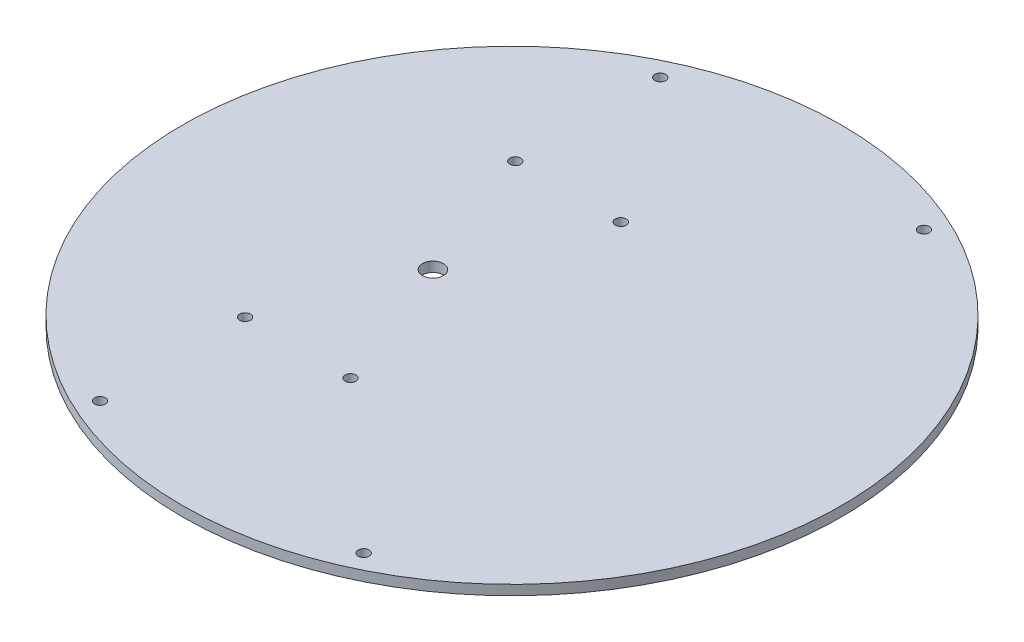
ISO-10303-21;
HEADER;
FILE_DESCRIPTION(('STEP AP214'),'2;1');
FILE_NAME('part.step','',(''),(''),'','','');
FILE_SCHEMA(('AUTOMOTIVE_DESIGN { 1 0 10303 214 1 1 1 1 }'));
ENDSEC;
DATA;
#1=APPLICATION_CONTEXT('core data for automotive mechanical design processes');
#2=APPLICATION_PROTOCOL_DEFINITION('international standard','automotive_design',2000,#1);
#3=PRODUCT_CONTEXT('',#1,'mechanical');
#4=PRODUCT('Part','Part','',(#3));
#5=PRODUCT_RELATED_PRODUCT_CATEGORY('part','',(#4));
#6=PRODUCT_DEFINITION_FORMATION('','',#4);
#7=PRODUCT_DEFINITION_CONTEXT('part definition',#1,'design');
#8=PRODUCT_DEFINITION('design','',#6,#7);
#9=PRODUCT_DEFINITION_SHAPE('','',#8);
#10=(LENGTH_UNIT() NAMED_UNIT(*) SI_UNIT(.MILLI.,.METRE.));
#11=(NAMED_UNIT(*) PLANE_ANGLE_UNIT() SI_UNIT($,.RADIAN.));
#12=(NAMED_UNIT(*) SI_UNIT($,.STERADIAN.) SOLID_ANGLE_UNIT());
#13=UNCERTAINTY_MEASURE_WITH_UNIT(LENGTH_MEASURE(1.E-05),#10,'distance_accuracy_value','');
#14=(GEOMETRIC_REPRESENTATION_CONTEXT(3) GLOBAL_UNCERTAINTY_ASSIGNED_CONTEXT((#13)) GLOBAL_UNIT_ASSIGNED_CONTEXT((#10,
#11,#12)) REPRESENTATION_CONTEXT('',''));
#15=CARTESIAN_POINT('',(0.,0.,0.));
#16=DIRECTION('',(0.,0.,1.));
#17=DIRECTION('',(1.,0.,0.));
#18=AXIS2_PLACEMENT_3D('',#15,#16,#17);
#19=CARTESIAN_POINT('',(0.,3.,0.));
#20=DIRECTION('',(0.,1.,0.));
#21=DIRECTION('',(0.,0.,1.));
#22=AXIS2_PLACEMENT_3D('',#19,#20,#21);
#23=PLANE('',#22);
#24=CARTESIAN_POINT('',(-40.,3.,85.));
#25=DIRECTION('',(0.,1.,0.));
#26=DIRECTION('',(0.,0.,-1.));
#27=AXIS2_PLACEMENT_3D('',#24,#25,#26);
#28=CIRCLE('',#27,1.65);
#29=CARTESIAN_POINT('',(-40.,3.,83.35));
#30=VERTEX_POINT('',#29);
#31=EDGE_CURVE('E110',#30,#30,#28,.T.);
#32=ORIENTED_EDGE('',*,*,#31,.F.);
#33=EDGE_LOOP('',(#32));
#34=FACE_BOUND('',#33,.T.);
#35=CARTESIAN_POINT('',(-7.99999999999998,3.,41.));
#36=DIRECTION('',(0.,1.,0.));
#37=DIRECTION('',(0.,0.,1.));
#38=AXIS2_PLACEMENT_3D('',#35,#36,#37);
#39=CIRCLE('',#38,1.65);
#40=CARTESIAN_POINT('',(-7.99999999999998,3.,42.65));
#41=VERTEX_POINT('',#40);
#42=EDGE_CURVE('E94',#41,#41,#39,.T.);
#43=ORIENTED_EDGE('',*,*,#42,.F.);
#44=EDGE_LOOP('',(#43));
#45=FACE_BOUND('',#44,.T.);
#46=CARTESIAN_POINT('',(-24.,3.,0.));
#47=DIRECTION('',(0.,1.,0.));
#48=DIRECTION('',(0.,0.,1.));
#49=AXIS2_PLACEMENT_3D('',#46,#47,#48);
#50=CIRCLE('',#49,3.175);
#51=CARTESIAN_POINT('',(-24.,3.,3.175));
#52=VERTEX_POINT('',#51);
#53=EDGE_CURVE('E78',#52,#52,#50,.T.);
#54=ORIENTED_EDGE('',*,*,#53,.F.);
#55=EDGE_LOOP('',(#54));
#56=FACE_BOUND('',#55,.T.);
#57=CARTESIAN_POINT('',(40.,3.,85.));
#58=DIRECTION('',(0.,1.,0.));
#59=DIRECTION('',(0.,0.,1.));
#60=AXIS2_PLACEMENT_3D('',#57,#58,#59);
#61=CIRCLE('',#60,1.65);
#62=CARTESIAN_POINT('',(40.,3.,86.65));
#63=VERTEX_POINT('',#62);
#64=EDGE_CURVE('E62',#63,#63,#61,.T.);
#65=ORIENTED_EDGE('',*,*,#64,.F.);
#66=EDGE_LOOP('',(#65));
#67=FACE_BOUND('',#66,.T.);
#68=CARTESIAN_POINT('',(0.,3.,0.));
#69=DIRECTION('',(0.,1.,0.));
#70=DIRECTION('',(0.,0.,1.));
#71=AXIS2_PLACEMENT_3D('',#68,#69,#70);
#72=CIRCLE('',#71,100.);
#73=CARTESIAN_POINT('',(0.,3.,100.));
#74=VERTEX_POINT('',#73);
#75=EDGE_CURVE('E10',#74,#74,#72,.T.);
#76=ORIENTED_EDGE('',*,*,#75,.T.);
#77=EDGE_LOOP('',(#76));
#78=FACE_BOUND('',#77,.T.);
#79=CARTESIAN_POINT('',(-40.,3.,-41.));
#80=DIRECTION('',(0.,1.,0.));
#81=DIRECTION('',(0.,0.,1.));
#82=AXIS2_PLACEMENT_3D('',#79,#80,#81);
#83=CIRCLE('',#82,1.65);
#84=CARTESIAN_POINT('',(-40.,3.,-39.35));
#85=VERTEX_POINT('',#84);
#86=EDGE_CURVE('E56',#85,#85,#83,.T.);
#87=ORIENTED_EDGE('',*,*,#86,.F.);
#88=EDGE_LOOP('',(#87));
#89=FACE_BOUND('',#88,.T.);
#90=CARTESIAN_POINT('',(-40.,3.,41.));
#91=DIRECTION('',(0.,1.,0.));
#92=DIRECTION('',(0.,0.,1.));
#93=AXIS2_PLACEMENT_3D('',#90,#91,#92);
#94=CIRCLE('',#93,1.65);
#95=CARTESIAN_POINT('',(-40.,3.,42.65));
#96=VERTEX_POINT('',#95);
#97=EDGE_CURVE('E70',#96,#96,#94,.T.);
#98=ORIENTED_EDGE('',*,*,#97,.F.);
#99=EDGE_LOOP('',(#98));
#100=FACE_BOUND('',#99,.T.);
#101=CARTESIAN_POINT('',(-8.00000000000003,3.,-41.));
#102=DIRECTION('',(0.,1.,0.));
#103=DIRECTION('',(0.,0.,1.));
#104=AXIS2_PLACEMENT_3D('',#101,#102,#103);
#105=CIRCLE('',#104,1.65);
#106=CARTESIAN_POINT('',(-8.00000000000003,3.,-39.35));
#107=VERTEX_POINT('',#106);
#108=EDGE_CURVE('E86',#107,#107,#105,.T.);
#109=ORIENTED_EDGE('',*,*,#108,.F.);
#110=EDGE_LOOP('',(#109));
#111=FACE_BOUND('',#110,.T.);
#112=CARTESIAN_POINT('',(40.,3.,-85.));
#113=DIRECTION('',(0.,1.,0.));
#114=DIRECTION('',(0.,0.,-1.));
#115=AXIS2_PLACEMENT_3D('',#112,#113,#114);
#116=CIRCLE('',#115,1.65);
#117=CARTESIAN_POINT('',(40.,3.,-86.65));
#118=VERTEX_POINT('',#117);
#119=EDGE_CURVE('E102',#118,#118,#116,.T.);
#120=ORIENTED_EDGE('',*,*,#119,.F.);
#121=EDGE_LOOP('',(#120));
#122=FACE_BOUND('',#121,.T.);
#123=CARTESIAN_POINT('',(-40.0000000000001,3.,-85.));
#124=DIRECTION('',(0.,1.,0.));
#125=DIRECTION('',(0.,0.,1.));
#126=AXIS2_PLACEMENT_3D('',#123,#124,#125);
#127=CIRCLE('',#126,1.65);
#128=CARTESIAN_POINT('',(-40.0000000000001,3.,-83.35));
#129=VERTEX_POINT('',#128);
#130=EDGE_CURVE('E118',#129,#129,#127,.T.);
#131=ORIENTED_EDGE('',*,*,#130,.F.);
#132=EDGE_LOOP('',(#131));
#133=FACE_BOUND('',#132,.T.);
#134=ADVANCED_FACE('F43',(#34,#45,#56,#67,#78,#89,#100,#111,#122,#133),#23,.T.);
#135=CARTESIAN_POINT('',(0.,0.,0.));
#136=DIRECTION('',(0.,1.,0.));
#137=DIRECTION('',(0.,0.,1.));
#138=AXIS2_PLACEMENT_3D('',#135,#136,#137);
#139=PLANE('',#138);
#140=CARTESIAN_POINT('',(0.,0.,0.));
#141=DIRECTION('',(0.,1.,0.));
#142=DIRECTION('',(0.,0.,1.));
#143=AXIS2_PLACEMENT_3D('',#140,#141,#142);
#144=CIRCLE('',#143,100.);
#145=CARTESIAN_POINT('',(0.,0.,100.));
#146=VERTEX_POINT('',#145);
#147=EDGE_CURVE('E47',#146,#146,#144,.T.);
#148=ORIENTED_EDGE('',*,*,#147,.F.);
#149=EDGE_LOOP('',(#148));
#150=FACE_BOUND('',#149,.T.);
#151=CARTESIAN_POINT('',(-40.,0.,-41.));
#152=DIRECTION('',(0.,1.,0.));
#153=DIRECTION('',(0.,0.,1.));
#154=AXIS2_PLACEMENT_3D('',#151,#152,#153);
#155=CIRCLE('',#154,1.65);
#156=CARTESIAN_POINT('',(-40.,0.,-39.35));
#157=VERTEX_POINT('',#156);
#158=EDGE_CURVE('E58',#157,#157,#155,.T.);
#159=ORIENTED_EDGE('',*,*,#158,.T.);
#160=EDGE_LOOP('',(#159));
#161=FACE_BOUND('',#160,.T.);
#162=CARTESIAN_POINT('',(40.,0.,85.));
#163=DIRECTION('',(0.,1.,0.));
#164=DIRECTION('',(0.,0.,1.));
#165=AXIS2_PLACEMENT_3D('',#162,#163,#164);
#166=CIRCLE('',#165,1.65);
#167=CARTESIAN_POINT('',(40.,0.,86.65));
#168=VERTEX_POINT('',#167);
#169=EDGE_CURVE('E66',#168,#168,#166,.T.);
#170=ORIENTED_EDGE('',*,*,#169,.T.);
#171=EDGE_LOOP('',(#170));
#172=FACE_BOUND('',#171,.T.);
#173=CARTESIAN_POINT('',(-40.,0.,41.));
#174=DIRECTION('',(0.,1.,0.));
#175=DIRECTION('',(0.,0.,1.));
#176=AXIS2_PLACEMENT_3D('',#173,#174,#175);
#177=CIRCLE('',#176,1.65);
#178=CARTESIAN_POINT('',(-40.,0.,42.65));
#179=VERTEX_POINT('',#178);
#180=EDGE_CURVE('E74',#179,#179,#177,.T.);
#181=ORIENTED_EDGE('',*,*,#180,.T.);
#182=EDGE_LOOP('',(#181));
#183=FACE_BOUND('',#182,.T.);
#184=CARTESIAN_POINT('',(-24.,0.,0.));
#185=DIRECTION('',(0.,1.,0.));
#186=DIRECTION('',(0.,0.,1.));
#187=AXIS2_PLACEMENT_3D('',#184,#185,#186);
#188=CIRCLE('',#187,3.175);
#189=CARTESIAN_POINT('',(-24.,0.,3.175));
#190=VERTEX_POINT('',#189);
#191=EDGE_CURVE('E82',#190,#190,#188,.T.);
#192=ORIENTED_EDGE('',*,*,#191,.T.);
#193=EDGE_LOOP('',(#192));
#194=FACE_BOUND('',#193,.T.);
#195=CARTESIAN_POINT('',(-8.00000000000003,0.,-41.));
#196=DIRECTION('',(0.,1.,0.));
#197=DIRECTION('',(0.,0.,1.));
#198=AXIS2_PLACEMENT_3D('',#195,#196,#197);
#199=CIRCLE('',#198,1.65);
#200=CARTESIAN_POINT('',(-8.00000000000003,0.,-39.35));
#201=VERTEX_POINT('',#200);
#202=EDGE_CURVE('E90',#201,#201,#199,.T.);
#203=ORIENTED_EDGE('',*,*,#202,.T.);
#204=EDGE_LOOP('',(#203));
#205=FACE_BOUND('',#204,.T.);
#206=CARTESIAN_POINT('',(-7.99999999999998,0.,41.));
#207=DIRECTION('',(0.,1.,0.));
#208=DIRECTION('',(0.,0.,1.));
#209=AXIS2_PLACEMENT_3D('',#206,#207,#208);
#210=CIRCLE('',#209,1.65);
#211=CARTESIAN_POINT('',(-7.99999999999998,0.,42.65));
#212=VERTEX_POINT('',#211);
#213=EDGE_CURVE('E98',#212,#212,#210,.T.);
#214=ORIENTED_EDGE('',*,*,#213,.T.);
#215=EDGE_LOOP('',(#214));
#216=FACE_BOUND('',#215,.T.);
#217=CARTESIAN_POINT('',(40.,0.,-85.));
#218=DIRECTION('',(0.,1.,0.));
#219=DIRECTION('',(0.,0.,-1.));
#220=AXIS2_PLACEMENT_3D('',#217,#218,#219);
#221=CIRCLE('',#220,1.65);
#222=CARTESIAN_POINT('',(40.,0.,-86.65));
#223=VERTEX_POINT('',#222);
#224=EDGE_CURVE('E106',#223,#223,#221,.T.);
#225=ORIENTED_EDGE('',*,*,#224,.T.);
#226=EDGE_LOOP('',(#225));
#227=FACE_BOUND('',#226,.T.);
#228=CARTESIAN_POINT('',(-40.,0.,85.));
#229=DIRECTION('',(0.,1.,0.));
#230=DIRECTION('',(0.,0.,-1.));
#231=AXIS2_PLACEMENT_3D('',#228,#229,#230);
#232=CIRCLE('',#231,1.65);
#233=CARTESIAN_POINT('',(-40.,0.,83.35));
#234=VERTEX_POINT('',#233);
#235=EDGE_CURVE('E114',#234,#234,#232,.T.);
#236=ORIENTED_EDGE('',*,*,#235,.T.);
#237=EDGE_LOOP('',(#236));
#238=FACE_BOUND('',#237,.T.);
#239=CARTESIAN_POINT('',(-40.0000000000001,0.,-85.));
#240=DIRECTION('',(0.,1.,0.));
#241=DIRECTION('',(0.,0.,1.));
#242=AXIS2_PLACEMENT_3D('',#239,#240,#241);
#243=CIRCLE('',#242,1.65);
#244=CARTESIAN_POINT('',(-40.0000000000001,0.,-83.35));
#245=VERTEX_POINT('',#244);
#246=EDGE_CURVE('E122',#245,#245,#243,.T.);
#247=ORIENTED_EDGE('',*,*,#246,.T.);
#248=EDGE_LOOP('',(#247));
#249=FACE_BOUND('',#248,.T.);
#250=ADVANCED_FACE('F134',(#150,#161,#172,#183,#194,#205,#216,#227,#238,#249),#139,.F.);
#251=CARTESIAN_POINT('',(0.,3.,0.));
#252=DIRECTION('',(0.,-1.,0.));
#253=DIRECTION('',(0.,0.,-1.));
#254=AXIS2_PLACEMENT_3D('',#251,#252,#253);
#255=CYLINDRICAL_SURFACE('',#254,100.);
#256=ORIENTED_EDGE('',*,*,#75,.F.);
#257=EDGE_LOOP('',(#256));
#258=FACE_BOUND('',#257,.T.);
#259=ORIENTED_EDGE('',*,*,#147,.T.);
#260=EDGE_LOOP('',(#259));
#261=FACE_BOUND('',#260,.T.);
#262=ADVANCED_FACE('F45',(#258,#261),#255,.T.);
#263=CARTESIAN_POINT('',(-40.,3.,-41.));
#264=DIRECTION('',(0.,-1.,0.));
#265=DIRECTION('',(0.,0.,-1.));
#266=AXIS2_PLACEMENT_3D('',#263,#264,#265);
#267=CYLINDRICAL_SURFACE('',#266,1.65);
#268=ORIENTED_EDGE('',*,*,#86,.T.);
#269=EDGE_LOOP('',(#268));
#270=FACE_BOUND('',#269,.T.);
#271=ORIENTED_EDGE('',*,*,#158,.F.);
#272=EDGE_LOOP('',(#271));
#273=FACE_BOUND('',#272,.T.);
#274=ADVANCED_FACE('F144',(#270,#273),#267,.F.);
#275=CARTESIAN_POINT('',(40.,3.,85.));
#276=DIRECTION('',(0.,-1.,0.));
#277=DIRECTION('',(0.,0.,-1.));
#278=AXIS2_PLACEMENT_3D('',#275,#276,#277);
#279=CYLINDRICAL_SURFACE('',#278,1.65);
#280=ORIENTED_EDGE('',*,*,#64,.T.);
#281=EDGE_LOOP('',(#280));
#282=FACE_BOUND('',#281,.T.);
#283=ORIENTED_EDGE('',*,*,#169,.F.);
#284=EDGE_LOOP('',(#283));
#285=FACE_BOUND('',#284,.T.);
#286=ADVANCED_FACE('F147',(#282,#285),#279,.F.);
#287=CARTESIAN_POINT('',(-40.,3.,41.));
#288=DIRECTION('',(0.,-1.,0.));
#289=DIRECTION('',(0.,0.,-1.));
#290=AXIS2_PLACEMENT_3D('',#287,#288,#289);
#291=CYLINDRICAL_SURFACE('',#290,1.65);
#292=ORIENTED_EDGE('',*,*,#97,.T.);
#293=EDGE_LOOP('',(#292));
#294=FACE_BOUND('',#293,.T.);
#295=ORIENTED_EDGE('',*,*,#180,.F.);
#296=EDGE_LOOP('',(#295));
#297=FACE_BOUND('',#296,.T.);
#298=ADVANCED_FACE('F151',(#294,#297),#291,.F.);
#299=CARTESIAN_POINT('',(-24.,3.,0.));
#300=DIRECTION('',(0.,-1.,0.));
#301=DIRECTION('',(0.,0.,-1.));
#302=AXIS2_PLACEMENT_3D('',#299,#300,#301);
#303=CYLINDRICAL_SURFACE('',#302,3.175);
#304=ORIENTED_EDGE('',*,*,#53,.T.);
#305=EDGE_LOOP('',(#304));
#306=FACE_BOUND('',#305,.T.);
#307=ORIENTED_EDGE('',*,*,#191,.F.);
#308=EDGE_LOOP('',(#307));
#309=FACE_BOUND('',#308,.T.);
#310=ADVANCED_FACE('F155',(#306,#309),#303,.F.);
#311=CARTESIAN_POINT('',(-8.00000000000003,3.,-41.));
#312=DIRECTION('',(0.,-1.,0.));
#313=DIRECTION('',(0.,0.,-1.));
#314=AXIS2_PLACEMENT_3D('',#311,#312,#313);
#315=CYLINDRICAL_SURFACE('',#314,1.65);
#316=ORIENTED_EDGE('',*,*,#108,.T.);
#317=EDGE_LOOP('',(#316));
#318=FACE_BOUND('',#317,.T.);
#319=ORIENTED_EDGE('',*,*,#202,.F.);
#320=EDGE_LOOP('',(#319));
#321=FACE_BOUND('',#320,.T.);
#322=ADVANCED_FACE('F159',(#318,#321),#315,.F.);
#323=CARTESIAN_POINT('',(-7.99999999999998,3.,41.));
#324=DIRECTION('',(0.,-1.,0.));
#325=DIRECTION('',(0.,0.,-1.));
#326=AXIS2_PLACEMENT_3D('',#323,#324,#325);
#327=CYLINDRICAL_SURFACE('',#326,1.65);
#328=ORIENTED_EDGE('',*,*,#42,.T.);
#329=EDGE_LOOP('',(#328));
#330=FACE_BOUND('',#329,.T.);
#331=ORIENTED_EDGE('',*,*,#213,.F.);
#332=EDGE_LOOP('',(#331));
#333=FACE_BOUND('',#332,.T.);
#334=ADVANCED_FACE('F163',(#330,#333),#327,.F.);
#335=CARTESIAN_POINT('',(40.,3.,-85.));
#336=DIRECTION('',(0.,-1.,0.));
#337=DIRECTION('',(0.,0.,-1.));
#338=AXIS2_PLACEMENT_3D('',#335,#336,#337);
#339=CYLINDRICAL_SURFACE('',#338,1.65);
#340=ORIENTED_EDGE('',*,*,#119,.T.);
#341=EDGE_LOOP('',(#340));
#342=FACE_BOUND('',#341,.T.);
#343=ORIENTED_EDGE('',*,*,#224,.F.);
#344=EDGE_LOOP('',(#343));
#345=FACE_BOUND('',#344,.T.);
#346=ADVANCED_FACE('F167',(#342,#345),#339,.F.);
#347=CARTESIAN_POINT('',(-40.,3.,85.));
#348=DIRECTION('',(0.,-1.,0.));
#349=DIRECTION('',(0.,0.,-1.));
#350=AXIS2_PLACEMENT_3D('',#347,#348,#349);
#351=CYLINDRICAL_SURFACE('',#350,1.65);
#352=ORIENTED_EDGE('',*,*,#31,.T.);
#353=EDGE_LOOP('',(#352));
#354=FACE_BOUND('',#353,.T.);
#355=ORIENTED_EDGE('',*,*,#235,.F.);
#356=EDGE_LOOP('',(#355));
#357=FACE_BOUND('',#356,.T.);
#358=ADVANCED_FACE('F171',(#354,#357),#351,.F.);
#359=CARTESIAN_POINT('',(-40.0000000000001,3.,-85.));
#360=DIRECTION('',(0.,-1.,0.));
#361=DIRECTION('',(0.,0.,-1.));
#362=AXIS2_PLACEMENT_3D('',#359,#360,#361);
#363=CYLINDRICAL_SURFACE('',#362,1.65);
#364=ORIENTED_EDGE('',*,*,#130,.T.);
#365=EDGE_LOOP('',(#364));
#366=FACE_BOUND('',#365,.T.);
#367=ORIENTED_EDGE('',*,*,#246,.F.);
#368=EDGE_LOOP('',(#367));
#369=FACE_BOUND('',#368,.T.);
#370=ADVANCED_FACE('F130',(#366,#369),#363,.F.);
#371=CLOSED_SHELL('',(#134,#250,#262,#274,#286,#298,#310,#322,#334,#346,#358,#370));
#372=MANIFOLD_SOLID_BREP('B2',#371);
#373=ADVANCED_BREP_SHAPE_REPRESENTATION('',(#18,#372),#14);
#374=SHAPE_DEFINITION_REPRESENTATION(#9,#373);
ENDSEC;
END-ISO-10303-21;
